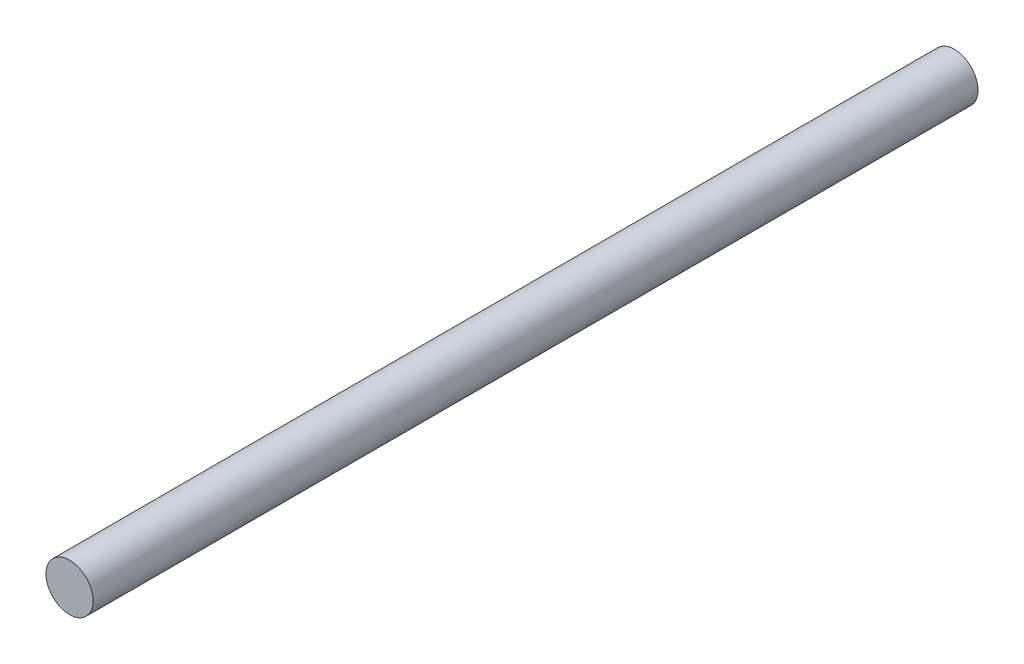
ISO-10303-21;
HEADER;
FILE_DESCRIPTION(('STEP AP214'),'2;1');
FILE_NAME('part.step','',(''),(''),'','','');
FILE_SCHEMA(('AUTOMOTIVE_DESIGN { 1 0 10303 214 1 1 1 1 }'));
ENDSEC;
DATA;
#1=APPLICATION_CONTEXT('core data for automotive mechanical design processes');
#2=APPLICATION_PROTOCOL_DEFINITION('international standard','automotive_design',2000,#1);
#3=PRODUCT_CONTEXT('',#1,'mechanical');
#4=PRODUCT('Part','Part','',(#3));
#5=PRODUCT_RELATED_PRODUCT_CATEGORY('part','',(#4));
#6=PRODUCT_DEFINITION_FORMATION('','',#4);
#7=PRODUCT_DEFINITION_CONTEXT('part definition',#1,'design');
#8=PRODUCT_DEFINITION('design','',#6,#7);
#9=PRODUCT_DEFINITION_SHAPE('','',#8);
#10=(LENGTH_UNIT() NAMED_UNIT(*) SI_UNIT(.MILLI.,.METRE.));
#11=(NAMED_UNIT(*) PLANE_ANGLE_UNIT() SI_UNIT($,.RADIAN.));
#12=(NAMED_UNIT(*) SI_UNIT($,.STERADIAN.) SOLID_ANGLE_UNIT());
#13=UNCERTAINTY_MEASURE_WITH_UNIT(LENGTH_MEASURE(1.E-05),#10,'distance_accuracy_value','');
#14=(GEOMETRIC_REPRESENTATION_CONTEXT(3) GLOBAL_UNCERTAINTY_ASSIGNED_CONTEXT((#13)) GLOBAL_UNIT_ASSIGNED_CONTEXT((#10,
#11,#12)) REPRESENTATION_CONTEXT('',''));
#15=CARTESIAN_POINT('',(0.,0.,0.));
#16=DIRECTION('',(0.,0.,1.));
#17=DIRECTION('',(1.,0.,0.));
#18=AXIS2_PLACEMENT_3D('',#15,#16,#17);
#19=CARTESIAN_POINT('',(0.,0.,150.));
#20=DIRECTION('',(0.,0.,-1.));
#21=DIRECTION('',(-1.,0.,0.));
#22=AXIS2_PLACEMENT_3D('',#19,#20,#21);
#23=CYLINDRICAL_SURFACE('',#22,4.);
#24=CARTESIAN_POINT('',(0.,0.,150.));
#25=DIRECTION('',(0.,0.,1.));
#26=DIRECTION('',(1.,0.,0.));
#27=AXIS2_PLACEMENT_3D('',#24,#25,#26);
#28=CIRCLE('',#27,4.);
#29=CARTESIAN_POINT('',(4.,0.,150.));
#30=VERTEX_POINT('',#29);
#31=EDGE_CURVE('E10',#30,#30,#28,.T.);
#32=ORIENTED_EDGE('',*,*,#31,.F.);
#33=EDGE_LOOP('',(#32));
#34=FACE_BOUND('',#33,.T.);
#35=CARTESIAN_POINT('',(0.,0.,0.));
#36=DIRECTION('',(0.,0.,1.));
#37=DIRECTION('',(1.,0.,0.));
#38=AXIS2_PLACEMENT_3D('',#35,#36,#37);
#39=CIRCLE('',#38,4.);
#40=CARTESIAN_POINT('',(4.,0.,0.));
#41=VERTEX_POINT('',#40);
#42=EDGE_CURVE('E31',#41,#41,#39,.T.);
#43=ORIENTED_EDGE('',*,*,#42,.T.);
#44=EDGE_LOOP('',(#43));
#45=FACE_BOUND('',#44,.T.);
#46=ADVANCED_FACE('F28',(#34,#45),#23,.T.);
#47=CARTESIAN_POINT('',(0.,0.,150.));
#48=DIRECTION('',(0.,0.,1.));
#49=DIRECTION('',(1.,0.,0.));
#50=AXIS2_PLACEMENT_3D('',#47,#48,#49);
#51=PLANE('',#50);
#52=ORIENTED_EDGE('',*,*,#31,.T.);
#53=EDGE_LOOP('',(#52));
#54=FACE_BOUND('',#53,.T.);
#55=ADVANCED_FACE('F43',(#54),#51,.T.);
#56=CARTESIAN_POINT('',(0.,0.,0.));
#57=DIRECTION('',(0.,0.,1.));
#58=DIRECTION('',(1.,0.,0.));
#59=AXIS2_PLACEMENT_3D('',#56,#57,#58);
#60=PLANE('',#59);
#61=ORIENTED_EDGE('',*,*,#42,.F.);
#62=EDGE_LOOP('',(#61));
#63=FACE_BOUND('',#62,.T.);
#64=ADVANCED_FACE('F41',(#63),#60,.F.);
#65=CLOSED_SHELL('',(#46,#55,#64));
#66=MANIFOLD_SOLID_BREP('B2',#65);
#67=ADVANCED_BREP_SHAPE_REPRESENTATION('',(#18,#66),#14);
#68=SHAPE_DEFINITION_REPRESENTATION(#9,#67);
ENDSEC;
END-ISO-10303-21;
